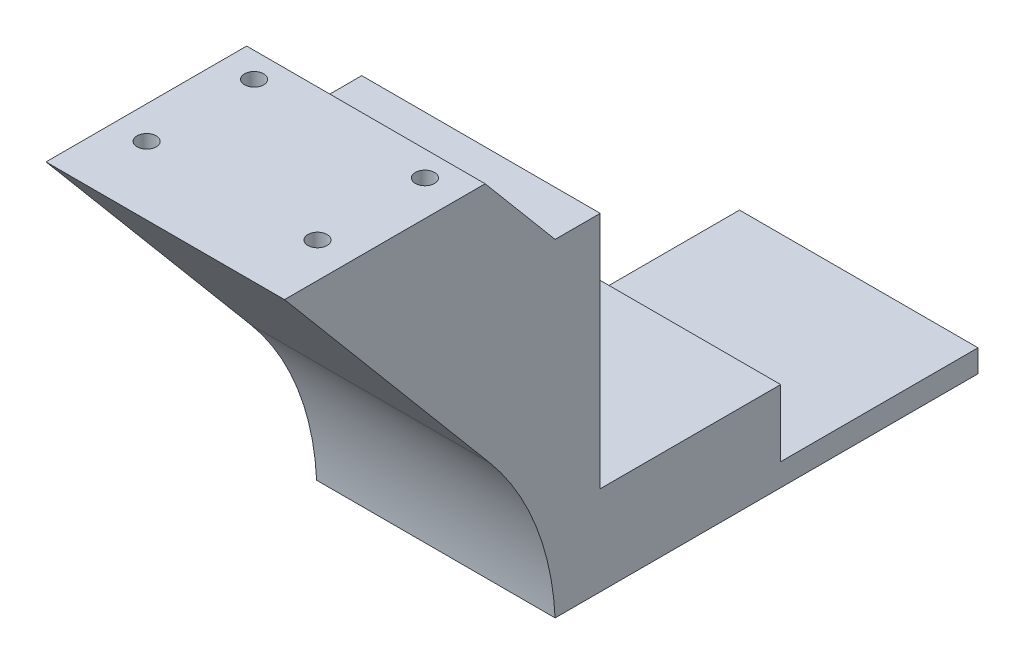
ISO-10303-21;
HEADER;
FILE_DESCRIPTION(('STEP AP214'),'2;1');
FILE_NAME('part.step','',(''),(''),'','','');
FILE_SCHEMA(('AUTOMOTIVE_DESIGN { 1 0 10303 214 1 1 1 1 }'));
ENDSEC;
DATA;
#1=APPLICATION_CONTEXT('core data for automotive mechanical design processes');
#2=APPLICATION_PROTOCOL_DEFINITION('international standard','automotive_design',2000,#1);
#3=PRODUCT_CONTEXT('',#1,'mechanical');
#4=PRODUCT('Part','Part','',(#3));
#5=PRODUCT_RELATED_PRODUCT_CATEGORY('part','',(#4));
#6=PRODUCT_DEFINITION_FORMATION('','',#4);
#7=PRODUCT_DEFINITION_CONTEXT('part definition',#1,'design');
#8=PRODUCT_DEFINITION('design','',#6,#7);
#9=PRODUCT_DEFINITION_SHAPE('','',#8);
#10=(LENGTH_UNIT() NAMED_UNIT(*) SI_UNIT(.MILLI.,.METRE.));
#11=(NAMED_UNIT(*) PLANE_ANGLE_UNIT() SI_UNIT($,.RADIAN.));
#12=(NAMED_UNIT(*) SI_UNIT($,.STERADIAN.) SOLID_ANGLE_UNIT());
#13=UNCERTAINTY_MEASURE_WITH_UNIT(LENGTH_MEASURE(1.E-05),#10,'distance_accuracy_value','');
#14=(GEOMETRIC_REPRESENTATION_CONTEXT(3) GLOBAL_UNCERTAINTY_ASSIGNED_CONTEXT((#13)) GLOBAL_UNIT_ASSIGNED_CONTEXT((#10,
#11,#12)) REPRESENTATION_CONTEXT('',''));
#15=CARTESIAN_POINT('',(0.,0.,0.));
#16=DIRECTION('',(0.,0.,1.));
#17=DIRECTION('',(1.,0.,0.));
#18=AXIS2_PLACEMENT_3D('',#15,#16,#17);
#19=CARTESIAN_POINT('',(0.,0.,6.));
#20=DIRECTION('',(-1.,0.,0.));
#21=DIRECTION('',(0.,-1.,0.));
#22=AXIS2_PLACEMENT_3D('',#19,#20,#21);
#23=PLANE('',#22);
#24=DIRECTION('',(0.,1.,0.));
#25=VECTOR('',#24,1.);
#26=CARTESIAN_POINT('',(0.,0.,0.));
#27=LINE('',#26,#25);
#28=CARTESIAN_POINT('',(0.,0.,0.));
#29=VERTEX_POINT('',#28);
#30=CARTESIAN_POINT('',(0.,42.3,0.));
#31=VERTEX_POINT('',#30);
#32=EDGE_CURVE('E287',#29,#31,#27,.T.);
#33=ORIENTED_EDGE('',*,*,#32,.T.);
#34=DIRECTION('',(0.,0.,-1.));
#35=VECTOR('',#34,1.);
#36=CARTESIAN_POINT('',(0.,42.3,6.));
#37=LINE('',#36,#35);
#38=CARTESIAN_POINT('',(0.,42.3,8.));
#39=VERTEX_POINT('',#38);
#40=EDGE_CURVE('E306',#39,#31,#37,.T.);
#41=ORIENTED_EDGE('',*,*,#40,.F.);
#42=DIRECTION('',(0.,-0.765189378618098,-0.643805261589286));
#43=VECTOR('',#42,1.);
#44=CARTESIAN_POINT('',(0.,42.3,8.));
#45=LINE('',#44,#43);
#46=CARTESIAN_POINT('',(0.,57.05,20.410166520596));
#47=VERTEX_POINT('',#46);
#48=EDGE_CURVE('E242',#47,#39,#45,.T.);
#49=ORIENTED_EDGE('',*,*,#48,.F.);
#50=DIRECTION('',(0.,0.,-1.));
#51=VECTOR('',#50,1.);
#52=CARTESIAN_POINT('',(0.,57.05,56.));
#53=LINE('',#52,#51);
#54=CARTESIAN_POINT('',(0.,57.05,56.));
#55=VERTEX_POINT('',#54);
#56=EDGE_CURVE('E237',#55,#47,#53,.T.);
#57=ORIENTED_EDGE('',*,*,#56,.F.);
#58=DIRECTION('',(0.,0.765189378618099,0.643805261589286));
#59=VECTOR('',#58,1.);
#60=CARTESIAN_POINT('',(0.,0.,8.));
#61=LINE('',#60,#59);
#62=CARTESIAN_POINT('',(0.,13.8822577312695,19.6800766187719));
#63=VERTEX_POINT('',#62);
#64=EDGE_CURVE('E234',#63,#55,#61,.T.);
#65=ORIENTED_EDGE('',*,*,#64,.F.);
#66=CARTESIAN_POINT('',(0.,-18.3080053481948,57.9395455496768));
#67=DIRECTION('',(-1.,0.,0.));
#68=DIRECTION('',(0.,-1.,0.));
#69=AXIS2_PLACEMENT_3D('',#66,#67,#68);
#70=CIRCLE('',#69,50.);
#71=CARTESIAN_POINT('',(0.,-15.85,8.));
#72=VERTEX_POINT('',#71);
#73=EDGE_CURVE('E11',#63,#72,#70,.T.);
#74=ORIENTED_EDGE('',*,*,#73,.T.);
#75=DIRECTION('',(0.,0.,-1.));
#76=VECTOR('',#75,1.);
#77=CARTESIAN_POINT('',(0.,-15.85,8.));
#78=LINE('',#77,#76);
#79=CARTESIAN_POINT('',(0.,-15.85,-67.));
#80=VERTEX_POINT('',#79);
#81=EDGE_CURVE('E146',#72,#80,#78,.T.);
#82=ORIENTED_EDGE('',*,*,#81,.T.);
#83=DIRECTION('',(0.,1.,0.));
#84=VECTOR('',#83,1.);
#85=CARTESIAN_POINT('',(0.,-15.85,-67.));
#86=LINE('',#85,#84);
#87=CARTESIAN_POINT('',(0.,-11.85,-67.));
#88=VERTEX_POINT('',#87);
#89=EDGE_CURVE('E179',#80,#88,#86,.T.);
#90=ORIENTED_EDGE('',*,*,#89,.T.);
#91=DIRECTION('',(0.,0.,1.));
#92=VECTOR('',#91,1.);
#93=CARTESIAN_POINT('',(0.,-11.85,-32.));
#94=LINE('',#93,#92);
#95=CARTESIAN_POINT('',(0.,-11.85,-32.));
#96=VERTEX_POINT('',#95);
#97=EDGE_CURVE('E183',#88,#96,#94,.T.);
#98=ORIENTED_EDGE('',*,*,#97,.T.);
#99=DIRECTION('',(0.,1.,0.));
#100=VECTOR('',#99,1.);
#101=CARTESIAN_POINT('',(0.,0.,-32.));
#102=LINE('',#101,#100);
#103=CARTESIAN_POINT('',(0.,0.,-32.));
#104=VERTEX_POINT('',#103);
#105=EDGE_CURVE('E164',#96,#104,#102,.T.);
#106=ORIENTED_EDGE('',*,*,#105,.T.);
#107=DIRECTION('',(0.,0.,1.));
#108=VECTOR('',#107,1.);
#109=CARTESIAN_POINT('',(0.,0.,8.));
#110=LINE('',#109,#108);
#111=EDGE_CURVE('E157',#104,#29,#110,.T.);
#112=ORIENTED_EDGE('',*,*,#111,.T.);
#113=EDGE_LOOP('',(#33,#41,#49,#57,#65,#74,#82,#90,#98,#106,#112));
#114=FACE_BOUND('',#113,.T.);
#115=ADVANCED_FACE('F43',(#114),#23,.F.);
#116=CARTESIAN_POINT('',(0.,42.3,6.));
#117=DIRECTION('',(0.,-1.,0.));
#118=DIRECTION('',(1.,0.,0.));
#119=AXIS2_PLACEMENT_3D('',#116,#117,#118);
#120=PLANE('',#119);
#121=DIRECTION('',(-1.,0.,0.));
#122=VECTOR('',#121,1.);
#123=CARTESIAN_POINT('',(0.,42.3,0.));
#124=LINE('',#123,#122);
#125=CARTESIAN_POINT('',(-42.3,42.3,0.));
#126=VERTEX_POINT('',#125);
#127=EDGE_CURVE('E292',#31,#126,#124,.T.);
#128=ORIENTED_EDGE('',*,*,#127,.T.);
#129=DIRECTION('',(0.,0.,-1.));
#130=VECTOR('',#129,1.);
#131=CARTESIAN_POINT('',(-42.3,42.3,6.));
#132=LINE('',#131,#130);
#133=CARTESIAN_POINT('',(-42.3,42.3,8.));
#134=VERTEX_POINT('',#133);
#135=EDGE_CURVE('E302',#134,#126,#132,.T.);
#136=ORIENTED_EDGE('',*,*,#135,.F.);
#137=DIRECTION('',(-1.,0.,0.));
#138=VECTOR('',#137,1.);
#139=CARTESIAN_POINT('',(0.,42.3,8.));
#140=LINE('',#139,#138);
#141=EDGE_CURVE('E256',#39,#134,#140,.T.);
#142=ORIENTED_EDGE('',*,*,#141,.F.);
#143=ORIENTED_EDGE('',*,*,#40,.T.);
#144=EDGE_LOOP('',(#128,#136,#142,#143));
#145=FACE_BOUND('',#144,.T.);
#146=ADVANCED_FACE('F344',(#145),#120,.F.);
#147=CARTESIAN_POINT('',(-42.3,0.,6.));
#148=DIRECTION('',(1.,0.,0.));
#149=DIRECTION('',(0.,0.,-1.));
#150=AXIS2_PLACEMENT_3D('',#147,#148,#149);
#151=PLANE('',#150);
#152=DIRECTION('',(0.,-1.,0.));
#153=VECTOR('',#152,1.);
#154=CARTESIAN_POINT('',(-42.3,0.,0.));
#155=LINE('',#154,#153);
#156=CARTESIAN_POINT('',(-42.3,0.,0.));
#157=VERTEX_POINT('',#156);
#158=EDGE_CURVE('E295',#126,#157,#155,.T.);
#159=ORIENTED_EDGE('',*,*,#158,.T.);
#160=DIRECTION('',(0.,0.,1.));
#161=VECTOR('',#160,1.);
#162=CARTESIAN_POINT('',(-42.3,0.,8.));
#163=LINE('',#162,#161);
#164=CARTESIAN_POINT('',(-42.3,0.,-32.));
#165=VERTEX_POINT('',#164);
#166=EDGE_CURVE('E149',#165,#157,#163,.T.);
#167=ORIENTED_EDGE('',*,*,#166,.F.);
#168=DIRECTION('',(0.,1.,0.));
#169=VECTOR('',#168,1.);
#170=CARTESIAN_POINT('',(-42.3,0.,-32.));
#171=LINE('',#170,#169);
#172=CARTESIAN_POINT('',(-42.3,-11.85,-32.));
#173=VERTEX_POINT('',#172);
#174=EDGE_CURVE('E170',#173,#165,#171,.T.);
#175=ORIENTED_EDGE('',*,*,#174,.F.);
#176=DIRECTION('',(0.,0.,1.));
#177=VECTOR('',#176,1.);
#178=CARTESIAN_POINT('',(-42.3,-11.85,-32.));
#179=LINE('',#178,#177);
#180=CARTESIAN_POINT('',(-42.3,-11.85,-67.));
#181=VERTEX_POINT('',#180);
#182=EDGE_CURVE('E161',#181,#173,#179,.T.);
#183=ORIENTED_EDGE('',*,*,#182,.F.);
#184=DIRECTION('',(0.,1.,0.));
#185=VECTOR('',#184,1.);
#186=CARTESIAN_POINT('',(-42.3,-15.85,-67.));
#187=LINE('',#186,#185);
#188=CARTESIAN_POINT('',(-42.3,-15.85,-67.));
#189=VERTEX_POINT('',#188);
#190=EDGE_CURVE('E155',#189,#181,#187,.T.);
#191=ORIENTED_EDGE('',*,*,#190,.F.);
#192=DIRECTION('',(0.,0.,-1.));
#193=VECTOR('',#192,1.);
#194=CARTESIAN_POINT('',(-42.3,-15.85,8.));
#195=LINE('',#194,#193);
#196=CARTESIAN_POINT('',(-42.3,-15.85,8.));
#197=VERTEX_POINT('',#196);
#198=EDGE_CURVE('E144',#197,#189,#195,.T.);
#199=ORIENTED_EDGE('',*,*,#198,.F.);
#200=CARTESIAN_POINT('',(-42.3,-18.3080053481948,57.9395455496768));
#201=DIRECTION('',(1.,0.,0.));
#202=DIRECTION('',(0.,0.,-1.));
#203=AXIS2_PLACEMENT_3D('',#200,#201,#202);
#204=CIRCLE('',#203,50.);
#205=CARTESIAN_POINT('',(-42.3,13.8822577312695,19.6800766187719));
#206=VERTEX_POINT('',#205);
#207=EDGE_CURVE('E52',#197,#206,#204,.T.);
#208=ORIENTED_EDGE('',*,*,#207,.T.);
#209=DIRECTION('',(0.,0.765189378618099,0.643805261589286));
#210=VECTOR('',#209,1.);
#211=CARTESIAN_POINT('',(-42.3,0.,8.));
#212=LINE('',#211,#210);
#213=CARTESIAN_POINT('',(-42.3,57.05,56.));
#214=VERTEX_POINT('',#213);
#215=EDGE_CURVE('E233',#206,#214,#212,.T.);
#216=ORIENTED_EDGE('',*,*,#215,.T.);
#217=DIRECTION('',(0.,0.,-1.));
#218=VECTOR('',#217,1.);
#219=CARTESIAN_POINT('',(-42.3,57.05,56.));
#220=LINE('',#219,#218);
#221=CARTESIAN_POINT('',(-42.3,57.05,20.410166520596));
#222=VERTEX_POINT('',#221);
#223=EDGE_CURVE('E249',#214,#222,#220,.T.);
#224=ORIENTED_EDGE('',*,*,#223,.T.);
#225=DIRECTION('',(0.,-0.765189378618098,-0.643805261589286));
#226=VECTOR('',#225,1.);
#227=CARTESIAN_POINT('',(-42.3,42.3,8.));
#228=LINE('',#227,#226);
#229=EDGE_CURVE('E238',#222,#134,#228,.T.);
#230=ORIENTED_EDGE('',*,*,#229,.T.);
#231=ORIENTED_EDGE('',*,*,#135,.T.);
#232=EDGE_LOOP('',(#159,#167,#175,#183,#191,#199,#208,#216,#224,#230,#231));
#233=FACE_BOUND('',#232,.T.);
#234=ADVANCED_FACE('F152',(#233),#151,.F.);
#235=CARTESIAN_POINT('',(0.,0.,0.));
#236=DIRECTION('',(0.,0.,1.));
#237=DIRECTION('',(1.,0.,0.));
#238=AXIS2_PLACEMENT_3D('',#235,#236,#237);
#239=PLANE('',#238);
#240=CARTESIAN_POINT('',(-36.65,36.65,0.));
#241=DIRECTION('',(0.,0.,1.));
#242=DIRECTION('',(1.,0.,0.));
#243=AXIS2_PLACEMENT_3D('',#240,#241,#242);
#244=CIRCLE('',#243,1.69999999999999);
#245=CARTESIAN_POINT('',(-34.95,36.65,0.));
#246=VERTEX_POINT('',#245);
#247=EDGE_CURVE('E271',#246,#246,#244,.T.);
#248=ORIENTED_EDGE('',*,*,#247,.T.);
#249=EDGE_LOOP('',(#248));
#250=FACE_BOUND('',#249,.T.);
#251=CARTESIAN_POINT('',(-5.65000000000001,5.64999999999999,0.));
#252=DIRECTION('',(0.,0.,1.));
#253=DIRECTION('',(1.,0.,0.));
#254=AXIS2_PLACEMENT_3D('',#251,#252,#253);
#255=CIRCLE('',#254,1.69999999999999);
#256=CARTESIAN_POINT('',(-3.95000000000002,5.64999999999999,0.));
#257=VERTEX_POINT('',#256);
#258=EDGE_CURVE('E313',#257,#257,#255,.T.);
#259=ORIENTED_EDGE('',*,*,#258,.T.);
#260=EDGE_LOOP('',(#259));
#261=FACE_BOUND('',#260,.T.);
#262=CARTESIAN_POINT('',(-36.65,5.64999999999999,0.));
#263=DIRECTION('',(0.,0.,1.));
#264=DIRECTION('',(1.,0.,0.));
#265=AXIS2_PLACEMENT_3D('',#262,#263,#264);
#266=CIRCLE('',#265,1.69999999999999);
#267=CARTESIAN_POINT('',(-34.95,5.64999999999999,0.));
#268=VERTEX_POINT('',#267);
#269=EDGE_CURVE('E288',#268,#268,#266,.T.);
#270=ORIENTED_EDGE('',*,*,#269,.T.);
#271=EDGE_LOOP('',(#270));
#272=FACE_BOUND('',#271,.T.);
#273=CARTESIAN_POINT('',(-5.65000000000001,36.65,0.));
#274=DIRECTION('',(0.,0.,1.));
#275=DIRECTION('',(1.,0.,0.));
#276=AXIS2_PLACEMENT_3D('',#273,#274,#275);
#277=CIRCLE('',#276,1.69999999999999);
#278=CARTESIAN_POINT('',(-3.95000000000002,36.65,0.));
#279=VERTEX_POINT('',#278);
#280=EDGE_CURVE('E283',#279,#279,#277,.T.);
#281=ORIENTED_EDGE('',*,*,#280,.T.);
#282=EDGE_LOOP('',(#281));
#283=FACE_BOUND('',#282,.T.);
#284=ORIENTED_EDGE('',*,*,#32,.F.);
#285=DIRECTION('',(1.,0.,0.));
#286=VECTOR('',#285,1.);
#287=CARTESIAN_POINT('',(0.,0.,0.));
#288=LINE('',#287,#286);
#289=EDGE_CURVE('E298',#157,#29,#288,.T.);
#290=ORIENTED_EDGE('',*,*,#289,.F.);
#291=ORIENTED_EDGE('',*,*,#158,.F.);
#292=ORIENTED_EDGE('',*,*,#127,.F.);
#293=EDGE_LOOP('',(#284,#290,#291,#292));
#294=FACE_BOUND('',#293,.T.);
#295=ADVANCED_FACE('F323',(#250,#261,#272,#283,#294),#239,.F.);
#296=CARTESIAN_POINT('',(-5.65000000000001,36.65,6.));
#297=DIRECTION('',(0.,0.,1.));
#298=DIRECTION('',(1.,0.,0.));
#299=AXIS2_PLACEMENT_3D('',#296,#297,#298);
#300=CYLINDRICAL_SURFACE('',#299,1.69999999999999);
#301=CARTESIAN_POINT('',(-5.65000000000001,36.65,6.));
#302=DIRECTION('',(0.,0.,1.));
#303=DIRECTION('',(1.,0.,0.));
#304=AXIS2_PLACEMENT_3D('',#301,#302,#303);
#305=CIRCLE('',#304,1.69999999999999);
#306=CARTESIAN_POINT('',(-3.95000000000002,36.65,6.));
#307=VERTEX_POINT('',#306);
#308=EDGE_CURVE('E260',#307,#307,#305,.T.);
#309=ORIENTED_EDGE('',*,*,#308,.T.);
#310=EDGE_LOOP('',(#309));
#311=FACE_BOUND('',#310,.T.);
#312=ORIENTED_EDGE('',*,*,#280,.F.);
#313=EDGE_LOOP('',(#312));
#314=FACE_BOUND('',#313,.T.);
#315=ADVANCED_FACE('F356',(#311,#314),#300,.F.);
#316=CARTESIAN_POINT('',(-36.65,5.64999999999999,6.));
#317=DIRECTION('',(0.,0.,1.));
#318=DIRECTION('',(1.,0.,0.));
#319=AXIS2_PLACEMENT_3D('',#316,#317,#318);
#320=CYLINDRICAL_SURFACE('',#319,1.69999999999999);
#321=CARTESIAN_POINT('',(-36.65,5.64999999999999,6.));
#322=DIRECTION('',(0.,0.,1.));
#323=DIRECTION('',(1.,0.,0.));
#324=AXIS2_PLACEMENT_3D('',#321,#322,#323);
#325=CIRCLE('',#324,1.69999999999999);
#326=CARTESIAN_POINT('',(-34.95,5.64999999999999,6.));
#327=VERTEX_POINT('',#326);
#328=EDGE_CURVE('E276',#327,#327,#325,.T.);
#329=ORIENTED_EDGE('',*,*,#328,.T.);
#330=EDGE_LOOP('',(#329));
#331=FACE_BOUND('',#330,.T.);
#332=ORIENTED_EDGE('',*,*,#269,.F.);
#333=EDGE_LOOP('',(#332));
#334=FACE_BOUND('',#333,.T.);
#335=ADVANCED_FACE('F340',(#331,#334),#320,.F.);
#336=CARTESIAN_POINT('',(-5.65000000000001,5.64999999999999,6.));
#337=DIRECTION('',(0.,0.,1.));
#338=DIRECTION('',(1.,0.,0.));
#339=AXIS2_PLACEMENT_3D('',#336,#337,#338);
#340=CYLINDRICAL_SURFACE('',#339,1.69999999999999);
#341=CARTESIAN_POINT('',(-5.65000000000001,5.64999999999999,6.));
#342=DIRECTION('',(0.,0.,1.));
#343=DIRECTION('',(1.,0.,0.));
#344=AXIS2_PLACEMENT_3D('',#341,#342,#343);
#345=CIRCLE('',#344,1.69999999999999);
#346=CARTESIAN_POINT('',(-3.95000000000002,5.64999999999999,6.));
#347=VERTEX_POINT('',#346);
#348=EDGE_CURVE('E272',#347,#347,#345,.T.);
#349=ORIENTED_EDGE('',*,*,#348,.T.);
#350=EDGE_LOOP('',(#349));
#351=FACE_BOUND('',#350,.T.);
#352=ORIENTED_EDGE('',*,*,#258,.F.);
#353=EDGE_LOOP('',(#352));
#354=FACE_BOUND('',#353,.T.);
#355=ADVANCED_FACE('F329',(#351,#354),#340,.F.);
#356=CARTESIAN_POINT('',(-36.65,36.65,6.));
#357=DIRECTION('',(0.,0.,1.));
#358=DIRECTION('',(1.,0.,0.));
#359=AXIS2_PLACEMENT_3D('',#356,#357,#358);
#360=CYLINDRICAL_SURFACE('',#359,1.69999999999999);
#361=CARTESIAN_POINT('',(-36.65,36.65,6.));
#362=DIRECTION('',(0.,0.,1.));
#363=DIRECTION('',(1.,0.,0.));
#364=AXIS2_PLACEMENT_3D('',#361,#362,#363);
#365=CIRCLE('',#364,1.69999999999999);
#366=CARTESIAN_POINT('',(-34.95,36.65,6.));
#367=VERTEX_POINT('',#366);
#368=EDGE_CURVE('E267',#367,#367,#365,.T.);
#369=ORIENTED_EDGE('',*,*,#368,.T.);
#370=EDGE_LOOP('',(#369));
#371=FACE_BOUND('',#370,.T.);
#372=ORIENTED_EDGE('',*,*,#247,.F.);
#373=EDGE_LOOP('',(#372));
#374=FACE_BOUND('',#373,.T.);
#375=ADVANCED_FACE('F326',(#371,#374),#360,.F.);
#376=CARTESIAN_POINT('',(0.,42.3,6.));
#377=DIRECTION('',(0.,0.,-1.));
#378=DIRECTION('',(-1.,0.,0.));
#379=AXIS2_PLACEMENT_3D('',#376,#377,#378);
#380=PLANE('',#379);
#381=ORIENTED_EDGE('',*,*,#308,.F.);
#382=EDGE_LOOP('',(#381));
#383=FACE_BOUND('',#382,.T.);
#384=ADVANCED_FACE('F328',(#383),#380,.T.);
#385=ORIENTED_EDGE('',*,*,#328,.F.);
#386=EDGE_LOOP('',(#385));
#387=FACE_BOUND('',#386,.T.);
#388=ADVANCED_FACE('F336',(#387),#380,.T.);
#389=ORIENTED_EDGE('',*,*,#348,.F.);
#390=EDGE_LOOP('',(#389));
#391=FACE_BOUND('',#390,.T.);
#392=ADVANCED_FACE('F449',(#391),#380,.T.);
#393=ORIENTED_EDGE('',*,*,#368,.F.);
#394=EDGE_LOOP('',(#393));
#395=FACE_BOUND('',#394,.T.);
#396=ADVANCED_FACE('F339',(#395),#380,.T.);
#397=CARTESIAN_POINT('',(0.,42.3,8.));
#398=DIRECTION('',(0.,0.643805261589286,-0.765189378618098));
#399=DIRECTION('',(0.,0.765189378618098,0.643805261589286));
#400=AXIS2_PLACEMENT_3D('',#397,#398,#399);
#401=PLANE('',#400);
#402=ORIENTED_EDGE('',*,*,#229,.F.);
#403=DIRECTION('',(-1.,0.,0.));
#404=VECTOR('',#403,1.);
#405=CARTESIAN_POINT('',(0.,57.05,20.410166520596));
#406=LINE('',#405,#404);
#407=EDGE_CURVE('E261',#47,#222,#406,.T.);
#408=ORIENTED_EDGE('',*,*,#407,.F.);
#409=ORIENTED_EDGE('',*,*,#48,.T.);
#410=ORIENTED_EDGE('',*,*,#141,.T.);
#411=EDGE_LOOP('',(#402,#408,#409,#410));
#412=FACE_BOUND('',#411,.T.);
#413=ADVANCED_FACE('F385',(#412),#401,.T.);
#414=CARTESIAN_POINT('',(0.,57.05,56.));
#415=DIRECTION('',(0.,1.,0.));
#416=DIRECTION('',(0.,0.,1.));
#417=AXIS2_PLACEMENT_3D('',#414,#415,#416);
#418=PLANE('',#417);
#419=CARTESIAN_POINT('',(-36.53,57.05,24.860166520596));
#420=DIRECTION('',(0.,1.,0.));
#421=DIRECTION('',(0.,0.,1.));
#422=AXIS2_PLACEMENT_3D('',#419,#420,#421);
#423=CIRCLE('',#422,1.69999999999999);
#424=CARTESIAN_POINT('',(-36.53,57.05,26.560166520596));
#425=VERTEX_POINT('',#424);
#426=EDGE_CURVE('E193',#425,#425,#423,.T.);
#427=ORIENTED_EDGE('',*,*,#426,.F.);
#428=EDGE_LOOP('',(#427));
#429=FACE_BOUND('',#428,.T.);
#430=CARTESIAN_POINT('',(-6.2299999999999,57.05,43.920166520596));
#431=DIRECTION('',(0.,1.,0.));
#432=DIRECTION('',(0.,0.,1.));
#433=AXIS2_PLACEMENT_3D('',#430,#431,#432);
#434=CIRCLE('',#433,1.69999999999999);
#435=CARTESIAN_POINT('',(-6.2299999999999,57.05,45.620166520596));
#436=VERTEX_POINT('',#435);
#437=EDGE_CURVE('E209',#436,#436,#434,.T.);
#438=ORIENTED_EDGE('',*,*,#437,.F.);
#439=EDGE_LOOP('',(#438));
#440=FACE_BOUND('',#439,.T.);
#441=CARTESIAN_POINT('',(-36.53,57.05,43.920166520596));
#442=DIRECTION('',(0.,1.,0.));
#443=DIRECTION('',(0.,0.,1.));
#444=AXIS2_PLACEMENT_3D('',#441,#442,#443);
#445=CIRCLE('',#444,1.69999999999999);
#446=CARTESIAN_POINT('',(-36.53,57.05,45.620166520596));
#447=VERTEX_POINT('',#446);
#448=EDGE_CURVE('E217',#447,#447,#445,.T.);
#449=ORIENTED_EDGE('',*,*,#448,.F.);
#450=EDGE_LOOP('',(#449));
#451=FACE_BOUND('',#450,.T.);
#452=CARTESIAN_POINT('',(-6.2299999999999,57.05,24.860166520596));
#453=DIRECTION('',(0.,1.,0.));
#454=DIRECTION('',(0.,0.,1.));
#455=AXIS2_PLACEMENT_3D('',#452,#453,#454);
#456=CIRCLE('',#455,1.69999999999999);
#457=CARTESIAN_POINT('',(-6.2299999999999,57.05,26.560166520596));
#458=VERTEX_POINT('',#457);
#459=EDGE_CURVE('E225',#458,#458,#456,.T.);
#460=ORIENTED_EDGE('',*,*,#459,.F.);
#461=EDGE_LOOP('',(#460));
#462=FACE_BOUND('',#461,.T.);
#463=ORIENTED_EDGE('',*,*,#223,.F.);
#464=DIRECTION('',(-1.,0.,0.));
#465=VECTOR('',#464,1.);
#466=CARTESIAN_POINT('',(0.,57.05,56.));
#467=LINE('',#466,#465);
#468=EDGE_CURVE('E246',#55,#214,#467,.T.);
#469=ORIENTED_EDGE('',*,*,#468,.F.);
#470=ORIENTED_EDGE('',*,*,#56,.T.);
#471=ORIENTED_EDGE('',*,*,#407,.T.);
#472=EDGE_LOOP('',(#463,#469,#470,#471));
#473=FACE_BOUND('',#472,.T.);
#474=ADVANCED_FACE('F391',(#429,#440,#451,#462,#473),#418,.T.);
#475=CARTESIAN_POINT('',(0.,0.,8.));
#476=DIRECTION('',(0.,-0.643805261589285,0.765189378618098));
#477=DIRECTION('',(0.,-0.765189378618099,-0.643805261589286));
#478=AXIS2_PLACEMENT_3D('',#475,#476,#477);
#479=PLANE('',#478);
#480=ORIENTED_EDGE('',*,*,#215,.F.);
#481=DIRECTION('',(-1.,0.,0.));
#482=VECTOR('',#481,1.);
#483=CARTESIAN_POINT('',(0.,13.8822577312695,19.6800766187719));
#484=LINE('',#483,#482);
#485=EDGE_CURVE('E59',#206,#63,#484,.F.);
#486=ORIENTED_EDGE('',*,*,#485,.T.);
#487=ORIENTED_EDGE('',*,*,#64,.T.);
#488=ORIENTED_EDGE('',*,*,#468,.T.);
#489=EDGE_LOOP('',(#480,#486,#487,#488));
#490=FACE_BOUND('',#489,.T.);
#491=ADVANCED_FACE('F392',(#490),#479,.T.);
#492=CARTESIAN_POINT('',(-6.2299999999999,53.05,24.860166520596));
#493=DIRECTION('',(0.,1.,0.));
#494=DIRECTION('',(0.,0.,1.));
#495=AXIS2_PLACEMENT_3D('',#492,#493,#494);
#496=CONICAL_SURFACE('',#495,1.7,1.02974425867665);
#497=CARTESIAN_POINT('',(-6.2299999999999,52.0285369476531,24.860166520596));
#498=VERTEX_POINT('',#497);
#499=VERTEX_LOOP('',#498);
#500=FACE_BOUND('',#499,.T.);
#501=CARTESIAN_POINT('',(-6.2299999999999,53.05,24.860166520596));
#502=DIRECTION('',(0.,1.,0.));
#503=DIRECTION('',(0.,0.,1.));
#504=AXIS2_PLACEMENT_3D('',#501,#502,#503);
#505=CIRCLE('',#504,1.7);
#506=CARTESIAN_POINT('',(-6.2299999999999,53.05,26.560166520596));
#507=VERTEX_POINT('',#506);
#508=EDGE_CURVE('E229',#507,#507,#505,.T.);
#509=ORIENTED_EDGE('',*,*,#508,.T.);
#510=EDGE_LOOP('',(#509));
#511=FACE_BOUND('',#510,.T.);
#512=ADVANCED_FACE('F437',(#500,#511),#496,.F.);
#513=CARTESIAN_POINT('',(-6.2299999999999,57.05,24.860166520596));
#514=DIRECTION('',(0.,1.,0.));
#515=DIRECTION('',(0.,0.,1.));
#516=AXIS2_PLACEMENT_3D('',#513,#514,#515);
#517=CYLINDRICAL_SURFACE('',#516,1.69999999999999);
#518=ORIENTED_EDGE('',*,*,#508,.F.);
#519=EDGE_LOOP('',(#518));
#520=FACE_BOUND('',#519,.T.);
#521=ORIENTED_EDGE('',*,*,#459,.T.);
#522=EDGE_LOOP('',(#521));
#523=FACE_BOUND('',#522,.T.);
#524=ADVANCED_FACE('F433',(#520,#523),#517,.F.);
#525=CARTESIAN_POINT('',(-36.53,53.05,43.920166520596));
#526=DIRECTION('',(0.,1.,0.));
#527=DIRECTION('',(0.,0.,1.));
#528=AXIS2_PLACEMENT_3D('',#525,#526,#527);
#529=CONICAL_SURFACE('',#528,1.7,1.02974425867665);
#530=CARTESIAN_POINT('',(-36.53,52.0285369476531,43.920166520596));
#531=VERTEX_POINT('',#530);
#532=VERTEX_LOOP('',#531);
#533=FACE_BOUND('',#532,.T.);
#534=CARTESIAN_POINT('',(-36.53,53.05,43.920166520596));
#535=DIRECTION('',(0.,1.,0.));
#536=DIRECTION('',(0.,0.,1.));
#537=AXIS2_PLACEMENT_3D('',#534,#535,#536);
#538=CIRCLE('',#537,1.7);
#539=CARTESIAN_POINT('',(-36.53,53.05,45.620166520596));
#540=VERTEX_POINT('',#539);
#541=EDGE_CURVE('E221',#540,#540,#538,.T.);
#542=ORIENTED_EDGE('',*,*,#541,.T.);
#543=EDGE_LOOP('',(#542));
#544=FACE_BOUND('',#543,.T.);
#545=ADVANCED_FACE('F429',(#533,#544),#529,.F.);
#546=CARTESIAN_POINT('',(-36.53,57.05,43.920166520596));
#547=DIRECTION('',(0.,1.,0.));
#548=DIRECTION('',(0.,0.,1.));
#549=AXIS2_PLACEMENT_3D('',#546,#547,#548);
#550=CYLINDRICAL_SURFACE('',#549,1.7);
#551=ORIENTED_EDGE('',*,*,#541,.F.);
#552=EDGE_LOOP('',(#551));
#553=FACE_BOUND('',#552,.T.);
#554=ORIENTED_EDGE('',*,*,#448,.T.);
#555=EDGE_LOOP('',(#554));
#556=FACE_BOUND('',#555,.T.);
#557=ADVANCED_FACE('F425',(#553,#556),#550,.F.);
#558=CARTESIAN_POINT('',(-6.2299999999999,53.05,43.920166520596));
#559=DIRECTION('',(0.,1.,0.));
#560=DIRECTION('',(0.,0.,1.));
#561=AXIS2_PLACEMENT_3D('',#558,#559,#560);
#562=CONICAL_SURFACE('',#561,1.7,1.02974425867665);
#563=CARTESIAN_POINT('',(-6.2299999999999,52.0285369476531,43.920166520596));
#564=VERTEX_POINT('',#563);
#565=VERTEX_LOOP('',#564);
#566=FACE_BOUND('',#565,.T.);
#567=CARTESIAN_POINT('',(-6.2299999999999,53.05,43.920166520596));
#568=DIRECTION('',(0.,1.,0.));
#569=DIRECTION('',(0.,0.,1.));
#570=AXIS2_PLACEMENT_3D('',#567,#568,#569);
#571=CIRCLE('',#570,1.7);
#572=CARTESIAN_POINT('',(-6.2299999999999,53.05,45.620166520596));
#573=VERTEX_POINT('',#572);
#574=EDGE_CURVE('E213',#573,#573,#571,.T.);
#575=ORIENTED_EDGE('',*,*,#574,.T.);
#576=EDGE_LOOP('',(#575));
#577=FACE_BOUND('',#576,.T.);
#578=ADVANCED_FACE('F421',(#566,#577),#562,.F.);
#579=CARTESIAN_POINT('',(-6.2299999999999,57.05,43.920166520596));
#580=DIRECTION('',(0.,1.,0.));
#581=DIRECTION('',(0.,0.,1.));
#582=AXIS2_PLACEMENT_3D('',#579,#580,#581);
#583=CYLINDRICAL_SURFACE('',#582,1.69999999999999);
#584=ORIENTED_EDGE('',*,*,#574,.F.);
#585=EDGE_LOOP('',(#584));
#586=FACE_BOUND('',#585,.T.);
#587=ORIENTED_EDGE('',*,*,#437,.T.);
#588=EDGE_LOOP('',(#587));
#589=FACE_BOUND('',#588,.T.);
#590=ADVANCED_FACE('F417',(#586,#589),#583,.F.);
#591=CARTESIAN_POINT('',(-36.53,53.05,24.860166520596));
#592=DIRECTION('',(0.,1.,0.));
#593=DIRECTION('',(0.,0.,1.));
#594=AXIS2_PLACEMENT_3D('',#591,#592,#593);
#595=CONICAL_SURFACE('',#594,1.7,1.02974425867665);
#596=CARTESIAN_POINT('',(-36.53,52.0285369476531,24.860166520596));
#597=VERTEX_POINT('',#596);
#598=VERTEX_LOOP('',#597);
#599=FACE_BOUND('',#598,.T.);
#600=CARTESIAN_POINT('',(-36.53,53.05,24.860166520596));
#601=DIRECTION('',(0.,1.,0.));
#602=DIRECTION('',(0.,0.,1.));
#603=AXIS2_PLACEMENT_3D('',#600,#601,#602);
#604=CIRCLE('',#603,1.7);
#605=CARTESIAN_POINT('',(-36.53,53.05,26.560166520596));
#606=VERTEX_POINT('',#605);
#607=EDGE_CURVE('E205',#606,#606,#604,.T.);
#608=ORIENTED_EDGE('',*,*,#607,.T.);
#609=EDGE_LOOP('',(#608));
#610=FACE_BOUND('',#609,.T.);
#611=ADVANCED_FACE('F413',(#599,#610),#595,.F.);
#612=CARTESIAN_POINT('',(-36.53,57.05,24.860166520596));
#613=DIRECTION('',(0.,1.,0.));
#614=DIRECTION('',(0.,0.,1.));
#615=AXIS2_PLACEMENT_3D('',#612,#613,#614);
#616=CYLINDRICAL_SURFACE('',#615,1.7);
#617=ORIENTED_EDGE('',*,*,#607,.F.);
#618=EDGE_LOOP('',(#617));
#619=FACE_BOUND('',#618,.T.);
#620=ORIENTED_EDGE('',*,*,#426,.T.);
#621=EDGE_LOOP('',(#620));
#622=FACE_BOUND('',#621,.T.);
#623=ADVANCED_FACE('F410',(#619,#622),#616,.F.);
#624=CARTESIAN_POINT('',(-42.3,0.,8.));
#625=DIRECTION('',(0.,1.,0.));
#626=DIRECTION('',(-1.,0.,0.));
#627=AXIS2_PLACEMENT_3D('',#624,#625,#626);
#628=PLANE('',#627);
#629=ORIENTED_EDGE('',*,*,#166,.T.);
#630=ORIENTED_EDGE('',*,*,#289,.T.);
#631=ORIENTED_EDGE('',*,*,#111,.F.);
#632=DIRECTION('',(1.,0.,0.));
#633=VECTOR('',#632,1.);
#634=CARTESIAN_POINT('',(-42.3,0.,-32.));
#635=LINE('',#634,#633);
#636=EDGE_CURVE('E190',#165,#104,#635,.T.);
#637=ORIENTED_EDGE('',*,*,#636,.F.);
#638=EDGE_LOOP('',(#629,#630,#631,#637));
#639=FACE_BOUND('',#638,.T.);
#640=ADVANCED_FACE('F375',(#639),#628,.T.);
#641=CARTESIAN_POINT('',(-42.3,0.,-32.));
#642=DIRECTION('',(0.,0.,-1.));
#643=DIRECTION('',(-1.,0.,0.));
#644=AXIS2_PLACEMENT_3D('',#641,#642,#643);
#645=PLANE('',#644);
#646=ORIENTED_EDGE('',*,*,#105,.F.);
#647=DIRECTION('',(1.,0.,0.));
#648=VECTOR('',#647,1.);
#649=CARTESIAN_POINT('',(-42.3,-11.85,-32.));
#650=LINE('',#649,#648);
#651=EDGE_CURVE('E194',#173,#96,#650,.T.);
#652=ORIENTED_EDGE('',*,*,#651,.F.);
#653=ORIENTED_EDGE('',*,*,#174,.T.);
#654=ORIENTED_EDGE('',*,*,#636,.T.);
#655=EDGE_LOOP('',(#646,#652,#653,#654));
#656=FACE_BOUND('',#655,.T.);
#657=ADVANCED_FACE('F380',(#656),#645,.T.);
#658=CARTESIAN_POINT('',(-42.3,-11.85,-32.));
#659=DIRECTION('',(0.,1.,0.));
#660=DIRECTION('',(-1.,0.,0.));
#661=AXIS2_PLACEMENT_3D('',#658,#659,#660);
#662=PLANE('',#661);
#663=ORIENTED_EDGE('',*,*,#97,.F.);
#664=DIRECTION('',(1.,0.,0.));
#665=VECTOR('',#664,1.);
#666=CARTESIAN_POINT('',(-42.3,-11.85,-67.));
#667=LINE('',#666,#665);
#668=EDGE_CURVE('E197',#181,#88,#667,.T.);
#669=ORIENTED_EDGE('',*,*,#668,.F.);
#670=ORIENTED_EDGE('',*,*,#182,.T.);
#671=ORIENTED_EDGE('',*,*,#651,.T.);
#672=EDGE_LOOP('',(#663,#669,#670,#671));
#673=FACE_BOUND('',#672,.T.);
#674=ADVANCED_FACE('F397',(#673),#662,.T.);
#675=CARTESIAN_POINT('',(-42.3,-15.85,-67.));
#676=DIRECTION('',(0.,0.,-1.));
#677=DIRECTION('',(-1.,0.,0.));
#678=AXIS2_PLACEMENT_3D('',#675,#676,#677);
#679=PLANE('',#678);
#680=ORIENTED_EDGE('',*,*,#89,.F.);
#681=DIRECTION('',(1.,0.,0.));
#682=VECTOR('',#681,1.);
#683=CARTESIAN_POINT('',(-42.3,-15.85,-67.));
#684=LINE('',#683,#682);
#685=EDGE_CURVE('E148',#189,#80,#684,.T.);
#686=ORIENTED_EDGE('',*,*,#685,.F.);
#687=ORIENTED_EDGE('',*,*,#190,.T.);
#688=ORIENTED_EDGE('',*,*,#668,.T.);
#689=EDGE_LOOP('',(#680,#686,#687,#688));
#690=FACE_BOUND('',#689,.T.);
#691=ADVANCED_FACE('F395',(#690),#679,.T.);
#692=CARTESIAN_POINT('',(-42.3,-15.85,8.));
#693=DIRECTION('',(0.,-1.,0.));
#694=DIRECTION('',(1.,0.,0.));
#695=AXIS2_PLACEMENT_3D('',#692,#693,#694);
#696=PLANE('',#695);
#697=ORIENTED_EDGE('',*,*,#81,.F.);
#698=DIRECTION('',(1.,0.,0.));
#699=VECTOR('',#698,1.);
#700=CARTESIAN_POINT('',(-42.3,-15.85,8.));
#701=LINE('',#700,#699);
#702=EDGE_CURVE('E138',#197,#72,#701,.T.);
#703=ORIENTED_EDGE('',*,*,#702,.F.);
#704=ORIENTED_EDGE('',*,*,#198,.T.);
#705=ORIENTED_EDGE('',*,*,#685,.T.);
#706=EDGE_LOOP('',(#697,#703,#704,#705));
#707=FACE_BOUND('',#706,.T.);
#708=ADVANCED_FACE('F143',(#707),#696,.T.);
#709=CARTESIAN_POINT('',(-42.3,-18.3080053481948,57.9395455496768));
#710=DIRECTION('',(1.,0.,0.));
#711=DIRECTION('',(0.,1.,0.));
#712=AXIS2_PLACEMENT_3D('',#709,#710,#711);
#713=CYLINDRICAL_SURFACE('',#712,50.);
#714=ORIENTED_EDGE('',*,*,#73,.F.);
#715=ORIENTED_EDGE('',*,*,#485,.F.);
#716=ORIENTED_EDGE('',*,*,#207,.F.);
#717=ORIENTED_EDGE('',*,*,#702,.T.);
#718=EDGE_LOOP('',(#714,#715,#716,#717));
#719=FACE_BOUND('',#718,.T.);
#720=ADVANCED_FACE('F45',(#719),#713,.F.);
#721=CLOSED_SHELL('',(#115,#146,#234,#295,#315,#335,#355,#375,#384,#388,#392,#396,#413,#474,
#491,#512,#524,#545,#557,#578,#590,#611,#623,#640,#657,#674,#691,#708,#720));
#722=MANIFOLD_SOLID_BREP('B2',#721);
#723=ADVANCED_BREP_SHAPE_REPRESENTATION('',(#18,#722),#14);
#724=SHAPE_DEFINITION_REPRESENTATION(#9,#723);
ENDSEC;
END-ISO-10303-21;
